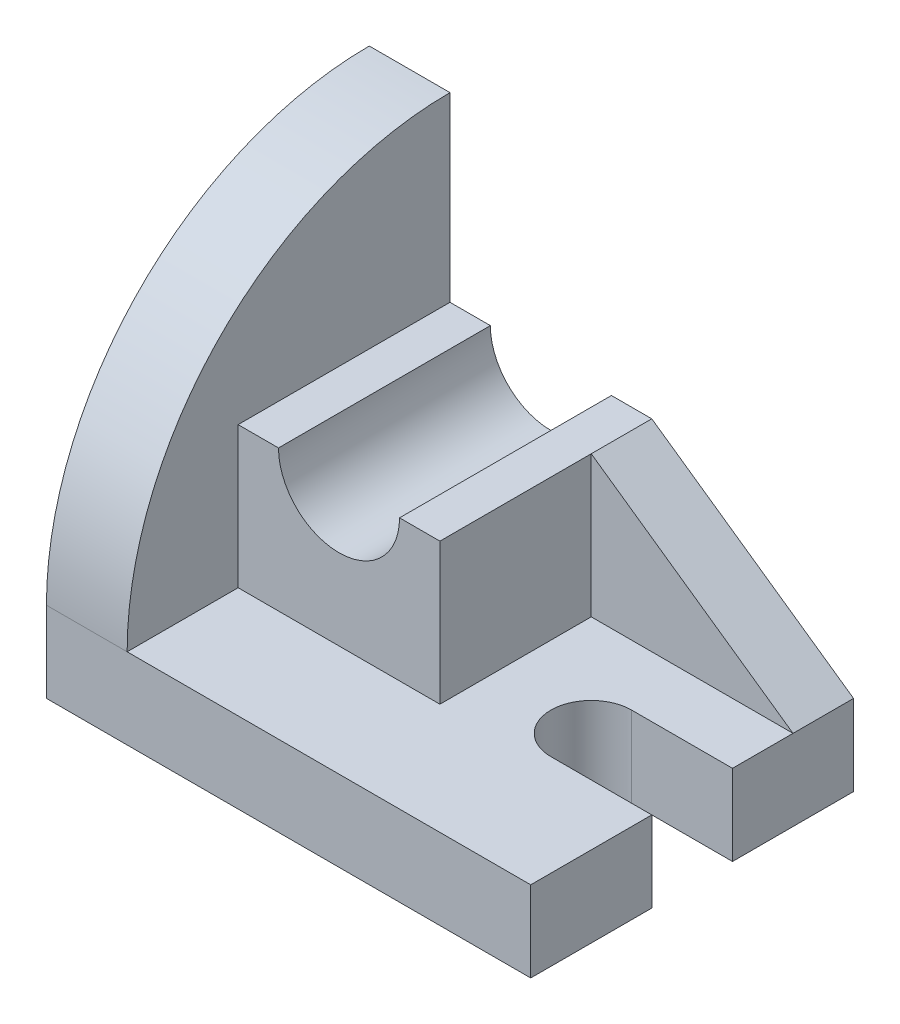
ISO-10303-21;
HEADER;
FILE_DESCRIPTION(('STEP AP214'),'2;1');
FILE_NAME('part.step','',(''),(''),'','','');
FILE_SCHEMA(('AUTOMOTIVE_DESIGN { 1 0 10303 214 1 1 1 1 }'));
ENDSEC;
DATA;
#1=APPLICATION_CONTEXT('core data for automotive mechanical design processes');
#2=APPLICATION_PROTOCOL_DEFINITION('international standard','automotive_design',2000,#1);
#3=PRODUCT_CONTEXT('',#1,'mechanical');
#4=PRODUCT('Part','Part','',(#3));
#5=PRODUCT_RELATED_PRODUCT_CATEGORY('part','',(#4));
#6=PRODUCT_DEFINITION_FORMATION('','',#4);
#7=PRODUCT_DEFINITION_CONTEXT('part definition',#1,'design');
#8=PRODUCT_DEFINITION('design','',#6,#7);
#9=PRODUCT_DEFINITION_SHAPE('','',#8);
#10=(LENGTH_UNIT() NAMED_UNIT(*) SI_UNIT(.MILLI.,.METRE.));
#11=(NAMED_UNIT(*) PLANE_ANGLE_UNIT() SI_UNIT($,.RADIAN.));
#12=(NAMED_UNIT(*) SI_UNIT($,.STERADIAN.) SOLID_ANGLE_UNIT());
#13=UNCERTAINTY_MEASURE_WITH_UNIT(LENGTH_MEASURE(1.E-05),#10,'distance_accuracy_value','');
#14=(GEOMETRIC_REPRESENTATION_CONTEXT(3) GLOBAL_UNCERTAINTY_ASSIGNED_CONTEXT((#13)) GLOBAL_UNIT_ASSIGNED_CONTEXT((#10,
#11,#12)) REPRESENTATION_CONTEXT('',''));
#15=CARTESIAN_POINT('',(0.,0.,0.));
#16=DIRECTION('',(0.,0.,1.));
#17=DIRECTION('',(1.,0.,0.));
#18=AXIS2_PLACEMENT_3D('',#15,#16,#17);
#19=CARTESIAN_POINT('',(71.12,40.64,0.));
#20=DIRECTION('',(0.,1.,0.));
#21=DIRECTION('',(0.,0.,1.));
#22=AXIS2_PLACEMENT_3D('',#19,#20,#21);
#23=PLANE('',#22);
#24=DIRECTION('',(0.,0.,-1.));
#25=VECTOR('',#24,1.);
#26=CARTESIAN_POINT('',(121.92,40.64,-20.32));
#27=LINE('',#26,#25);
#28=CARTESIAN_POINT('',(121.92,40.64,-20.32));
#29=VERTEX_POINT('',#28);
#30=CARTESIAN_POINT('',(121.92,40.64,-50.8));
#31=VERTEX_POINT('',#30);
#32=EDGE_CURVE('E160',#29,#31,#27,.T.);
#33=ORIENTED_EDGE('',*,*,#32,.T.);
#34=DIRECTION('',(1.,0.,0.));
#35=VECTOR('',#34,1.);
#36=CARTESIAN_POINT('',(20.32,40.64,-50.8));
#37=LINE('',#36,#35);
#38=CARTESIAN_POINT('',(20.32,40.64,-50.8));
#39=VERTEX_POINT('',#38);
#40=EDGE_CURVE('E164',#39,#31,#37,.T.);
#41=ORIENTED_EDGE('',*,*,#40,.F.);
#42=DIRECTION('',(0.,0.,-1.));
#43=VECTOR('',#42,1.);
#44=CARTESIAN_POINT('',(20.32,40.64,-81.28));
#45=LINE('',#44,#43);
#46=CARTESIAN_POINT('',(20.3200000000001,40.64,25.4));
#47=VERTEX_POINT('',#46);
#48=EDGE_CURVE('E57',#47,#39,#45,.T.);
#49=ORIENTED_EDGE('',*,*,#48,.F.);
#50=DIRECTION('',(1.,0.,0.));
#51=VECTOR('',#50,1.);
#52=CARTESIAN_POINT('',(20.3200000000001,40.64,25.4));
#53=LINE('',#52,#51);
#54=CARTESIAN_POINT('',(-81.2799999999999,40.64,25.4));
#55=VERTEX_POINT('',#54);
#56=EDGE_CURVE('E268',#55,#47,#53,.T.);
#57=ORIENTED_EDGE('',*,*,#56,.F.);
#58=DIRECTION('',(0.,0.,1.));
#59=VECTOR('',#58,1.);
#60=CARTESIAN_POINT('',(-81.2799999999999,40.64,81.28));
#61=LINE('',#60,#59);
#62=CARTESIAN_POINT('',(-81.2799999999999,40.64,81.28));
#63=VERTEX_POINT('',#62);
#64=EDGE_CURVE('E247',#55,#63,#61,.T.);
#65=ORIENTED_EDGE('',*,*,#64,.T.);
#66=DIRECTION('',(1.,0.,0.));
#67=VECTOR('',#66,1.);
#68=CARTESIAN_POINT('',(-121.92,40.64,81.28));
#69=LINE('',#68,#67);
#70=CARTESIAN_POINT('',(121.92,40.64,81.28));
#71=VERTEX_POINT('',#70);
#72=EDGE_CURVE('E171',#63,#71,#69,.T.);
#73=ORIENTED_EDGE('',*,*,#72,.T.);
#74=DIRECTION('',(0.,0.,-1.));
#75=VECTOR('',#74,1.);
#76=CARTESIAN_POINT('',(121.92,40.64,81.28));
#77=LINE('',#76,#75);
#78=CARTESIAN_POINT('',(121.92,40.64,20.32));
#79=VERTEX_POINT('',#78);
#80=EDGE_CURVE('E183',#71,#79,#77,.T.);
#81=ORIENTED_EDGE('',*,*,#80,.T.);
#82=DIRECTION('',(-1.,0.,0.));
#83=VECTOR('',#82,1.);
#84=CARTESIAN_POINT('',(121.92,40.64,20.32));
#85=LINE('',#84,#83);
#86=CARTESIAN_POINT('',(71.12,40.64,20.32));
#87=VERTEX_POINT('',#86);
#88=EDGE_CURVE('E185',#79,#87,#85,.T.);
#89=ORIENTED_EDGE('',*,*,#88,.T.);
#90=CARTESIAN_POINT('',(71.12,40.64,0.));
#91=DIRECTION('',(0.,-1.,0.));
#92=DIRECTION('',(0.,0.,1.));
#93=AXIS2_PLACEMENT_3D('',#90,#91,#92);
#94=CIRCLE('',#93,20.32);
#95=CARTESIAN_POINT('',(71.12,40.64,-20.32));
#96=VERTEX_POINT('',#95);
#97=EDGE_CURVE('E187',#87,#96,#94,.T.);
#98=ORIENTED_EDGE('',*,*,#97,.T.);
#99=DIRECTION('',(1.,0.,0.));
#100=VECTOR('',#99,1.);
#101=CARTESIAN_POINT('',(121.92,40.64,-20.32));
#102=LINE('',#101,#100);
#103=EDGE_CURVE('E169',#96,#29,#102,.T.);
#104=ORIENTED_EDGE('',*,*,#103,.T.);
#105=EDGE_LOOP('',(#33,#41,#49,#57,#65,#73,#81,#89,#98,#104));
#106=FACE_BOUND('',#105,.T.);
#107=ADVANCED_FACE('F34',(#106),#23,.T.);
#108=CARTESIAN_POINT('',(20.32,111.76,-81.28));
#109=DIRECTION('',(-1.,0.,0.));
#110=DIRECTION('',(0.,0.,1.));
#111=AXIS2_PLACEMENT_3D('',#108,#109,#110);
#112=PLANE('',#111);
#113=DIRECTION('',(0.,-1.,0.));
#114=VECTOR('',#113,1.);
#115=CARTESIAN_POINT('',(20.32,111.76,-50.8));
#116=LINE('',#115,#114);
#117=CARTESIAN_POINT('',(20.32,111.76,-50.8));
#118=VERTEX_POINT('',#117);
#119=EDGE_CURVE('E166',#118,#39,#116,.T.);
#120=ORIENTED_EDGE('',*,*,#119,.F.);
#121=DIRECTION('',(0.,0.,-1.));
#122=VECTOR('',#121,1.);
#123=CARTESIAN_POINT('',(20.32,111.76,-81.28));
#124=LINE('',#123,#122);
#125=CARTESIAN_POINT('',(20.3200000000001,111.76,25.4));
#126=VERTEX_POINT('',#125);
#127=EDGE_CURVE('E273',#126,#118,#124,.T.);
#128=ORIENTED_EDGE('',*,*,#127,.F.);
#129=DIRECTION('',(0.,-1.,0.));
#130=VECTOR('',#129,1.);
#131=CARTESIAN_POINT('',(20.3200000000001,111.76,25.4));
#132=LINE('',#131,#130);
#133=EDGE_CURVE('E257',#126,#47,#132,.T.);
#134=ORIENTED_EDGE('',*,*,#133,.T.);
#135=ORIENTED_EDGE('',*,*,#48,.T.);
#136=EDGE_LOOP('',(#120,#128,#134,#135));
#137=FACE_BOUND('',#136,.T.);
#138=ADVANCED_FACE('F300',(#137),#112,.F.);
#139=CARTESIAN_POINT('',(0.,111.76,0.));
#140=DIRECTION('',(0.,-1.,0.));
#141=DIRECTION('',(0.,0.,-1.));
#142=AXIS2_PLACEMENT_3D('',#139,#140,#141);
#143=PLANE('',#142);
#144=ORIENTED_EDGE('',*,*,#127,.T.);
#145=DIRECTION('',(0.,0.,1.));
#146=VECTOR('',#145,1.);
#147=CARTESIAN_POINT('',(20.32,111.76,-121.92));
#148=LINE('',#147,#146);
#149=CARTESIAN_POINT('',(20.32,111.76,-81.28));
#150=VERTEX_POINT('',#149);
#151=EDGE_CURVE('E150',#150,#118,#148,.T.);
#152=ORIENTED_EDGE('',*,*,#151,.F.);
#153=DIRECTION('',(-1.,0.,0.));
#154=VECTOR('',#153,1.);
#155=CARTESIAN_POINT('',(-81.2799999999999,111.76,-81.28));
#156=LINE('',#155,#154);
#157=CARTESIAN_POINT('',(0.,111.76,-81.28));
#158=VERTEX_POINT('',#157);
#159=EDGE_CURVE('E265',#150,#158,#156,.T.);
#160=ORIENTED_EDGE('',*,*,#159,.T.);
#161=DIRECTION('',(0.,0.,1.));
#162=VECTOR('',#161,1.);
#163=CARTESIAN_POINT('',(0.,111.76,-81.28));
#164=LINE('',#163,#162);
#165=CARTESIAN_POINT('',(0.,111.76,25.4));
#166=VERTEX_POINT('',#165);
#167=EDGE_CURVE('E285',#158,#166,#164,.T.);
#168=ORIENTED_EDGE('',*,*,#167,.T.);
#169=DIRECTION('',(1.,0.,0.));
#170=VECTOR('',#169,1.);
#171=CARTESIAN_POINT('',(20.3200000000001,111.76,25.4));
#172=LINE('',#171,#170);
#173=EDGE_CURVE('E279',#166,#126,#172,.T.);
#174=ORIENTED_EDGE('',*,*,#173,.T.);
#175=EDGE_LOOP('',(#144,#152,#160,#168,#174));
#176=FACE_BOUND('',#175,.T.);
#177=ADVANCED_FACE('F295',(#176),#143,.F.);
#178=CARTESIAN_POINT('',(-81.2799999999999,40.64,-81.28));
#179=DIRECTION('',(-1.,0.,0.));
#180=DIRECTION('',(0.,0.,1.));
#181=AXIS2_PLACEMENT_3D('',#178,#179,#180);
#182=PLANE('',#181);
#183=DIRECTION('',(0.,-1.,0.));
#184=VECTOR('',#183,1.);
#185=CARTESIAN_POINT('',(-81.2799999999999,111.76,25.4));
#186=LINE('',#185,#184);
#187=CARTESIAN_POINT('',(-81.2799999999999,111.76,25.4));
#188=VERTEX_POINT('',#187);
#189=EDGE_CURVE('E253',#188,#55,#186,.T.);
#190=ORIENTED_EDGE('',*,*,#189,.F.);
#191=DIRECTION('',(0.,0.,1.));
#192=VECTOR('',#191,1.);
#193=CARTESIAN_POINT('',(-81.2799999999999,111.76,25.4));
#194=LINE('',#193,#192);
#195=CARTESIAN_POINT('',(-81.2799999999999,111.76,-81.28));
#196=VERTEX_POINT('',#195);
#197=EDGE_CURVE('E267',#196,#188,#194,.T.);
#198=ORIENTED_EDGE('',*,*,#197,.F.);
#199=DIRECTION('',(0.,-1.,0.));
#200=VECTOR('',#199,1.);
#201=CARTESIAN_POINT('',(-81.2799999999999,40.64,-81.28));
#202=LINE('',#201,#200);
#203=CARTESIAN_POINT('',(-81.2799999999999,203.2,-81.28));
#204=VERTEX_POINT('',#203);
#205=EDGE_CURVE('E254',#204,#196,#202,.T.);
#206=ORIENTED_EDGE('',*,*,#205,.F.);
#207=CARTESIAN_POINT('',(-81.2799999999999,40.64,-81.28));
#208=DIRECTION('',(-1.,0.,0.));
#209=DIRECTION('',(0.,0.,1.));
#210=AXIS2_PLACEMENT_3D('',#207,#208,#209);
#211=CIRCLE('',#210,162.56);
#212=EDGE_CURVE('E252',#63,#204,#211,.T.);
#213=ORIENTED_EDGE('',*,*,#212,.F.);
#214=ORIENTED_EDGE('',*,*,#64,.F.);
#215=EDGE_LOOP('',(#190,#198,#206,#213,#214));
#216=FACE_BOUND('',#215,.T.);
#217=ADVANCED_FACE('F305',(#216),#182,.F.);
#218=CARTESIAN_POINT('',(121.92,40.64,-20.32));
#219=DIRECTION('',(-1.,0.,0.));
#220=DIRECTION('',(0.,0.,1.));
#221=AXIS2_PLACEMENT_3D('',#218,#219,#220);
#222=PLANE('',#221);
#223=DIRECTION('',(0.,-1.,0.));
#224=VECTOR('',#223,1.);
#225=CARTESIAN_POINT('',(121.92,40.64,-81.28));
#226=LINE('',#225,#224);
#227=CARTESIAN_POINT('',(121.92,40.64,-81.28));
#228=VERTEX_POINT('',#227);
#229=CARTESIAN_POINT('',(121.92,0.,-81.28));
#230=VERTEX_POINT('',#229);
#231=EDGE_CURVE('E11',#228,#230,#226,.T.);
#232=ORIENTED_EDGE('',*,*,#231,.F.);
#233=DIRECTION('',(0.,0.,1.));
#234=VECTOR('',#233,1.);
#235=CARTESIAN_POINT('',(121.92,40.64,-121.92));
#236=LINE('',#235,#234);
#237=EDGE_CURVE('E147',#228,#31,#236,.T.);
#238=ORIENTED_EDGE('',*,*,#237,.T.);
#239=ORIENTED_EDGE('',*,*,#32,.F.);
#240=DIRECTION('',(0.,-1.,0.));
#241=VECTOR('',#240,1.);
#242=CARTESIAN_POINT('',(121.92,40.64,-20.32));
#243=LINE('',#242,#241);
#244=CARTESIAN_POINT('',(121.92,0.,-20.32));
#245=VERTEX_POINT('',#244);
#246=EDGE_CURVE('E190',#29,#245,#243,.T.);
#247=ORIENTED_EDGE('',*,*,#246,.T.);
#248=DIRECTION('',(0.,0.,-1.));
#249=VECTOR('',#248,1.);
#250=CARTESIAN_POINT('',(121.92,0.,-20.32));
#251=LINE('',#250,#249);
#252=EDGE_CURVE('E191',#245,#230,#251,.T.);
#253=ORIENTED_EDGE('',*,*,#252,.T.);
#254=EDGE_LOOP('',(#232,#238,#239,#247,#253));
#255=FACE_BOUND('',#254,.T.);
#256=ADVANCED_FACE('F36',(#255),#222,.F.);
#257=CARTESIAN_POINT('',(-121.92,40.64,-81.28));
#258=DIRECTION('',(0.,0.,1.));
#259=DIRECTION('',(1.,0.,0.));
#260=AXIS2_PLACEMENT_3D('',#257,#258,#259);
#261=PLANE('',#260);
#262=ORIENTED_EDGE('',*,*,#159,.F.);
#263=DIRECTION('',(0.819231920519041,-0.573462344363328,0.));
#264=VECTOR('',#263,1.);
#265=CARTESIAN_POINT('',(-41.7310067114094,155.195704697987,-81.28));
#266=LINE('',#265,#264);
#267=EDGE_CURVE('E162',#150,#228,#266,.T.);
#268=ORIENTED_EDGE('',*,*,#267,.T.);
#269=ORIENTED_EDGE('',*,*,#231,.T.);
#270=DIRECTION('',(-1.,0.,0.));
#271=VECTOR('',#270,1.);
#272=CARTESIAN_POINT('',(-121.92,0.,-81.28));
#273=LINE('',#272,#271);
#274=CARTESIAN_POINT('',(-121.92,0.,-81.28));
#275=VERTEX_POINT('',#274);
#276=EDGE_CURVE('E193',#230,#275,#273,.T.);
#277=ORIENTED_EDGE('',*,*,#276,.T.);
#278=DIRECTION('',(0.,-1.,0.));
#279=VECTOR('',#278,1.);
#280=CARTESIAN_POINT('',(-121.92,40.64,-81.28));
#281=LINE('',#280,#279);
#282=CARTESIAN_POINT('',(-121.92,203.2,-81.28));
#283=VERTEX_POINT('',#282);
#284=EDGE_CURVE('E42',#283,#275,#281,.T.);
#285=ORIENTED_EDGE('',*,*,#284,.F.);
#286=DIRECTION('',(-1.,0.,0.));
#287=VECTOR('',#286,1.);
#288=CARTESIAN_POINT('',(-81.2799999999999,203.2,-81.28));
#289=LINE('',#288,#287);
#290=EDGE_CURVE('E179',#204,#283,#289,.T.);
#291=ORIENTED_EDGE('',*,*,#290,.F.);
#292=ORIENTED_EDGE('',*,*,#205,.T.);
#293=CARTESIAN_POINT('',(-60.9599999999999,111.76,-81.28));
#294=VERTEX_POINT('',#293);
#295=EDGE_CURVE('E272',#294,#196,#156,.T.);
#296=ORIENTED_EDGE('',*,*,#295,.F.);
#297=CARTESIAN_POINT('',(-30.48,111.76,-81.28));
#298=DIRECTION('',(0.,0.,1.));
#299=DIRECTION('',(-1.,0.,0.));
#300=AXIS2_PLACEMENT_3D('',#297,#298,#299);
#301=CIRCLE('',#300,30.4799999999999);
#302=EDGE_CURVE('E49',#294,#158,#301,.T.);
#303=ORIENTED_EDGE('',*,*,#302,.T.);
#304=EDGE_LOOP('',(#262,#268,#269,#277,#285,#291,#292,#296,#303));
#305=FACE_BOUND('',#304,.T.);
#306=ADVANCED_FACE('F293',(#305),#261,.F.);
#307=CARTESIAN_POINT('',(-121.92,40.64,81.28));
#308=DIRECTION('',(1.,0.,0.));
#309=DIRECTION('',(0.,0.,-1.));
#310=AXIS2_PLACEMENT_3D('',#307,#308,#309);
#311=PLANE('',#310);
#312=DIRECTION('',(0.,0.,1.));
#313=VECTOR('',#312,1.);
#314=CARTESIAN_POINT('',(-121.92,0.,81.28));
#315=LINE('',#314,#313);
#316=CARTESIAN_POINT('',(-121.92,0.,81.28));
#317=VERTEX_POINT('',#316);
#318=EDGE_CURVE('E195',#275,#317,#315,.T.);
#319=ORIENTED_EDGE('',*,*,#318,.T.);
#320=DIRECTION('',(0.,-1.,0.));
#321=VECTOR('',#320,1.);
#322=CARTESIAN_POINT('',(-121.92,40.64,81.28));
#323=LINE('',#322,#321);
#324=CARTESIAN_POINT('',(-121.92,40.64,81.28));
#325=VERTEX_POINT('',#324);
#326=EDGE_CURVE('E217',#325,#317,#323,.T.);
#327=ORIENTED_EDGE('',*,*,#326,.F.);
#328=CARTESIAN_POINT('',(-121.92,40.64,-81.28));
#329=DIRECTION('',(-1.,0.,0.));
#330=DIRECTION('',(0.,0.,1.));
#331=AXIS2_PLACEMENT_3D('',#328,#329,#330);
#332=CIRCLE('',#331,162.56);
#333=EDGE_CURVE('E225',#325,#283,#332,.T.);
#334=ORIENTED_EDGE('',*,*,#333,.T.);
#335=ORIENTED_EDGE('',*,*,#284,.T.);
#336=EDGE_LOOP('',(#319,#327,#334,#335));
#337=FACE_BOUND('',#336,.T.);
#338=ADVANCED_FACE('F223',(#337),#311,.F.);
#339=CARTESIAN_POINT('',(-121.92,40.64,81.28));
#340=DIRECTION('',(0.,0.,-1.));
#341=DIRECTION('',(-1.,0.,0.));
#342=AXIS2_PLACEMENT_3D('',#339,#340,#341);
#343=PLANE('',#342);
#344=DIRECTION('',(1.,0.,0.));
#345=VECTOR('',#344,1.);
#346=CARTESIAN_POINT('',(-121.92,0.,81.28));
#347=LINE('',#346,#345);
#348=CARTESIAN_POINT('',(121.92,0.,81.28));
#349=VERTEX_POINT('',#348);
#350=EDGE_CURVE('E197',#317,#349,#347,.T.);
#351=ORIENTED_EDGE('',*,*,#350,.T.);
#352=DIRECTION('',(0.,-1.,0.));
#353=VECTOR('',#352,1.);
#354=CARTESIAN_POINT('',(121.92,40.64,81.28));
#355=LINE('',#354,#353);
#356=EDGE_CURVE('E214',#71,#349,#355,.T.);
#357=ORIENTED_EDGE('',*,*,#356,.F.);
#358=ORIENTED_EDGE('',*,*,#72,.F.);
#359=EDGE_CURVE('E174',#325,#63,#69,.T.);
#360=ORIENTED_EDGE('',*,*,#359,.F.);
#361=ORIENTED_EDGE('',*,*,#326,.T.);
#362=EDGE_LOOP('',(#351,#357,#358,#360,#361));
#363=FACE_BOUND('',#362,.T.);
#364=ADVANCED_FACE('F237',(#363),#343,.F.);
#365=CARTESIAN_POINT('',(121.92,40.64,81.28));
#366=DIRECTION('',(-1.,0.,0.));
#367=DIRECTION('',(0.,0.,1.));
#368=AXIS2_PLACEMENT_3D('',#365,#366,#367);
#369=PLANE('',#368);
#370=DIRECTION('',(0.,0.,-1.));
#371=VECTOR('',#370,1.);
#372=CARTESIAN_POINT('',(121.92,0.,81.28));
#373=LINE('',#372,#371);
#374=CARTESIAN_POINT('',(121.92,0.,20.32));
#375=VERTEX_POINT('',#374);
#376=EDGE_CURVE('E199',#349,#375,#373,.T.);
#377=ORIENTED_EDGE('',*,*,#376,.T.);
#378=DIRECTION('',(0.,-1.,0.));
#379=VECTOR('',#378,1.);
#380=CARTESIAN_POINT('',(121.92,40.64,20.32));
#381=LINE('',#380,#379);
#382=EDGE_CURVE('E211',#79,#375,#381,.T.);
#383=ORIENTED_EDGE('',*,*,#382,.F.);
#384=ORIENTED_EDGE('',*,*,#80,.F.);
#385=ORIENTED_EDGE('',*,*,#356,.T.);
#386=EDGE_LOOP('',(#377,#383,#384,#385));
#387=FACE_BOUND('',#386,.T.);
#388=ADVANCED_FACE('F242',(#387),#369,.F.);
#389=CARTESIAN_POINT('',(121.92,40.64,20.32));
#390=DIRECTION('',(0.,0.,1.));
#391=DIRECTION('',(1.,0.,0.));
#392=AXIS2_PLACEMENT_3D('',#389,#390,#391);
#393=PLANE('',#392);
#394=DIRECTION('',(-1.,0.,0.));
#395=VECTOR('',#394,1.);
#396=CARTESIAN_POINT('',(121.92,0.,20.32));
#397=LINE('',#396,#395);
#398=CARTESIAN_POINT('',(71.12,0.,20.32));
#399=VERTEX_POINT('',#398);
#400=EDGE_CURVE('E201',#375,#399,#397,.T.);
#401=ORIENTED_EDGE('',*,*,#400,.T.);
#402=DIRECTION('',(0.,-1.,0.));
#403=VECTOR('',#402,1.);
#404=CARTESIAN_POINT('',(71.12,40.64,20.32));
#405=LINE('',#404,#403);
#406=EDGE_CURVE('E208',#87,#399,#405,.T.);
#407=ORIENTED_EDGE('',*,*,#406,.F.);
#408=ORIENTED_EDGE('',*,*,#88,.F.);
#409=ORIENTED_EDGE('',*,*,#382,.T.);
#410=EDGE_LOOP('',(#401,#407,#408,#409));
#411=FACE_BOUND('',#410,.T.);
#412=ADVANCED_FACE('F338',(#411),#393,.F.);
#413=CARTESIAN_POINT('',(71.12,40.64,0.));
#414=DIRECTION('',(0.,-1.,0.));
#415=DIRECTION('',(0.,0.,-1.));
#416=AXIS2_PLACEMENT_3D('',#413,#414,#415);
#417=CYLINDRICAL_SURFACE('',#416,20.32);
#418=CARTESIAN_POINT('',(71.12,0.,0.));
#419=DIRECTION('',(0.,-1.,0.));
#420=DIRECTION('',(0.,0.,1.));
#421=AXIS2_PLACEMENT_3D('',#418,#419,#420);
#422=CIRCLE('',#421,20.32);
#423=CARTESIAN_POINT('',(71.12,0.,-20.32));
#424=VERTEX_POINT('',#423);
#425=EDGE_CURVE('E176',#399,#424,#422,.T.);
#426=ORIENTED_EDGE('',*,*,#425,.T.);
#427=DIRECTION('',(0.,-1.,0.));
#428=VECTOR('',#427,1.);
#429=CARTESIAN_POINT('',(71.12,40.64,-20.32));
#430=LINE('',#429,#428);
#431=EDGE_CURVE('E205',#96,#424,#430,.T.);
#432=ORIENTED_EDGE('',*,*,#431,.F.);
#433=ORIENTED_EDGE('',*,*,#97,.F.);
#434=ORIENTED_EDGE('',*,*,#406,.T.);
#435=EDGE_LOOP('',(#426,#432,#433,#434));
#436=FACE_BOUND('',#435,.T.);
#437=ADVANCED_FACE('F334',(#436),#417,.F.);
#438=CARTESIAN_POINT('',(121.92,40.64,-20.32));
#439=DIRECTION('',(0.,0.,-1.));
#440=DIRECTION('',(-1.,0.,0.));
#441=AXIS2_PLACEMENT_3D('',#438,#439,#440);
#442=PLANE('',#441);
#443=DIRECTION('',(1.,0.,0.));
#444=VECTOR('',#443,1.);
#445=CARTESIAN_POINT('',(121.92,0.,-20.32));
#446=LINE('',#445,#444);
#447=EDGE_CURVE('E172',#424,#245,#446,.T.);
#448=ORIENTED_EDGE('',*,*,#447,.T.);
#449=ORIENTED_EDGE('',*,*,#246,.F.);
#450=ORIENTED_EDGE('',*,*,#103,.F.);
#451=ORIENTED_EDGE('',*,*,#431,.T.);
#452=EDGE_LOOP('',(#448,#449,#450,#451));
#453=FACE_BOUND('',#452,.T.);
#454=ADVANCED_FACE('F331',(#453),#442,.F.);
#455=CARTESIAN_POINT('',(71.12,0.,0.));
#456=DIRECTION('',(0.,1.,0.));
#457=DIRECTION('',(0.,0.,1.));
#458=AXIS2_PLACEMENT_3D('',#455,#456,#457);
#459=PLANE('',#458);
#460=ORIENTED_EDGE('',*,*,#252,.F.);
#461=ORIENTED_EDGE('',*,*,#447,.F.);
#462=ORIENTED_EDGE('',*,*,#425,.F.);
#463=ORIENTED_EDGE('',*,*,#400,.F.);
#464=ORIENTED_EDGE('',*,*,#376,.F.);
#465=ORIENTED_EDGE('',*,*,#350,.F.);
#466=ORIENTED_EDGE('',*,*,#318,.F.);
#467=ORIENTED_EDGE('',*,*,#276,.F.);
#468=EDGE_LOOP('',(#460,#461,#462,#463,#464,#465,#466,#467));
#469=FACE_BOUND('',#468,.T.);
#470=ADVANCED_FACE('F232',(#469),#459,.F.);
#471=CARTESIAN_POINT('',(-81.2799999999999,40.64,-81.28));
#472=DIRECTION('',(-1.,0.,0.));
#473=DIRECTION('',(0.,0.,1.));
#474=AXIS2_PLACEMENT_3D('',#471,#472,#473);
#475=CYLINDRICAL_SURFACE('',#474,162.56);
#476=ORIENTED_EDGE('',*,*,#333,.F.);
#477=ORIENTED_EDGE('',*,*,#359,.T.);
#478=ORIENTED_EDGE('',*,*,#212,.T.);
#479=ORIENTED_EDGE('',*,*,#290,.T.);
#480=EDGE_LOOP('',(#476,#477,#478,#479));
#481=FACE_BOUND('',#480,.T.);
#482=ADVANCED_FACE('F251',(#481),#475,.T.);
#483=CARTESIAN_POINT('',(20.3200000000001,111.76,25.4));
#484=DIRECTION('',(0.,0.,-1.));
#485=DIRECTION('',(-1.,0.,0.));
#486=AXIS2_PLACEMENT_3D('',#483,#484,#485);
#487=PLANE('',#486);
#488=ORIENTED_EDGE('',*,*,#173,.F.);
#489=CARTESIAN_POINT('',(-30.48,111.76,25.4));
#490=DIRECTION('',(0.,0.,-1.));
#491=DIRECTION('',(-1.,0.,0.));
#492=AXIS2_PLACEMENT_3D('',#489,#490,#491);
#493=CIRCLE('',#492,30.4799999999999);
#494=CARTESIAN_POINT('',(-60.9599999999999,111.76,25.4));
#495=VERTEX_POINT('',#494);
#496=EDGE_CURVE('E270',#166,#495,#493,.T.);
#497=ORIENTED_EDGE('',*,*,#496,.T.);
#498=EDGE_CURVE('E276',#188,#495,#172,.T.);
#499=ORIENTED_EDGE('',*,*,#498,.F.);
#500=ORIENTED_EDGE('',*,*,#189,.T.);
#501=ORIENTED_EDGE('',*,*,#56,.T.);
#502=ORIENTED_EDGE('',*,*,#133,.F.);
#503=EDGE_LOOP('',(#488,#497,#499,#500,#501,#502));
#504=FACE_BOUND('',#503,.T.);
#505=ADVANCED_FACE('F302',(#504),#487,.F.);
#506=ORIENTED_EDGE('',*,*,#498,.T.);
#507=DIRECTION('',(0.,0.,1.));
#508=VECTOR('',#507,1.);
#509=CARTESIAN_POINT('',(-60.9599999999999,111.76,-81.28));
#510=LINE('',#509,#508);
#511=EDGE_CURVE('E284',#294,#495,#510,.T.);
#512=ORIENTED_EDGE('',*,*,#511,.F.);
#513=ORIENTED_EDGE('',*,*,#295,.T.);
#514=ORIENTED_EDGE('',*,*,#197,.T.);
#515=EDGE_LOOP('',(#506,#512,#513,#514));
#516=FACE_BOUND('',#515,.T.);
#517=ADVANCED_FACE('F310',(#516),#143,.F.);
#518=CARTESIAN_POINT('',(-30.48,111.76,-81.28));
#519=DIRECTION('',(0.,0.,1.));
#520=DIRECTION('',(1.,0.,0.));
#521=AXIS2_PLACEMENT_3D('',#518,#519,#520);
#522=CYLINDRICAL_SURFACE('',#521,30.4799999999999);
#523=ORIENTED_EDGE('',*,*,#167,.F.);
#524=ORIENTED_EDGE('',*,*,#302,.F.);
#525=ORIENTED_EDGE('',*,*,#511,.T.);
#526=ORIENTED_EDGE('',*,*,#496,.F.);
#527=EDGE_LOOP('',(#523,#524,#525,#526));
#528=FACE_BOUND('',#527,.T.);
#529=ADVANCED_FACE('F311',(#528),#522,.F.);
#530=CARTESIAN_POINT('',(20.32,111.76,-50.8));
#531=DIRECTION('',(0.,0.,-1.));
#532=DIRECTION('',(-1.,0.,0.));
#533=AXIS2_PLACEMENT_3D('',#530,#531,#532);
#534=PLANE('',#533);
#535=ORIENTED_EDGE('',*,*,#40,.T.);
#536=DIRECTION('',(0.819231920519041,-0.573462344363328,0.));
#537=VECTOR('',#536,1.);
#538=CARTESIAN_POINT('',(20.32,111.76,-50.8));
#539=LINE('',#538,#537);
#540=EDGE_CURVE('E144',#118,#31,#539,.T.);
#541=ORIENTED_EDGE('',*,*,#540,.F.);
#542=ORIENTED_EDGE('',*,*,#119,.T.);
#543=EDGE_LOOP('',(#535,#541,#542));
#544=FACE_BOUND('',#543,.T.);
#545=ADVANCED_FACE('F165',(#544),#534,.F.);
#546=CARTESIAN_POINT('',(20.32,111.76,-121.92));
#547=DIRECTION('',(-0.573462344363328,-0.81923192051904,0.));
#548=DIRECTION('',(0.819231920519041,-0.573462344363328,0.));
#549=AXIS2_PLACEMENT_3D('',#546,#547,#548);
#550=PLANE('',#549);
#551=ORIENTED_EDGE('',*,*,#151,.T.);
#552=ORIENTED_EDGE('',*,*,#540,.T.);
#553=ORIENTED_EDGE('',*,*,#237,.F.);
#554=ORIENTED_EDGE('',*,*,#267,.F.);
#555=EDGE_LOOP('',(#551,#552,#553,#554));
#556=FACE_BOUND('',#555,.T.);
#557=ADVANCED_FACE('F146',(#556),#550,.F.);
#558=CLOSED_SHELL('',(#107,#138,#177,#217,#256,#306,#338,#364,#388,#412,#437,#454,#470,#482,
#505,#517,#529,#545,#557));
#559=MANIFOLD_SOLID_BREP('B2',#558);
#560=ADVANCED_BREP_SHAPE_REPRESENTATION('',(#18,#559),#14);
#561=SHAPE_DEFINITION_REPRESENTATION(#9,#560);
ENDSEC;
END-ISO-10303-21;
